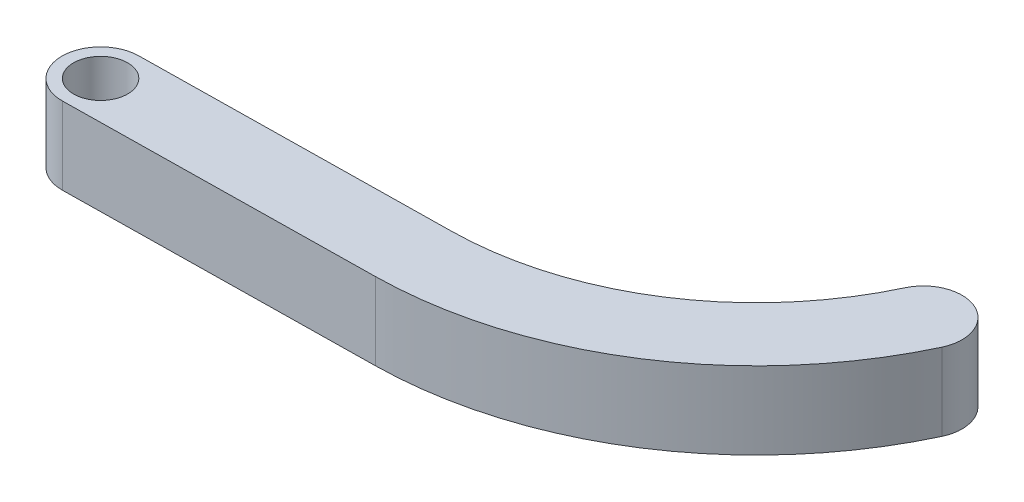
ISO-10303-21;
HEADER;
FILE_DESCRIPTION(('STEP AP214'),'2;1');
FILE_NAME('part.step','',(''),(''),'','','');
FILE_SCHEMA(('AUTOMOTIVE_DESIGN { 1 0 10303 214 1 1 1 1 }'));
ENDSEC;
DATA;
#1=APPLICATION_CONTEXT('core data for automotive mechanical design processes');
#2=APPLICATION_PROTOCOL_DEFINITION('international standard','automotive_design',2000,#1);
#3=PRODUCT_CONTEXT('',#1,'mechanical');
#4=PRODUCT('Part','Part','',(#3));
#5=PRODUCT_RELATED_PRODUCT_CATEGORY('part','',(#4));
#6=PRODUCT_DEFINITION_FORMATION('','',#4);
#7=PRODUCT_DEFINITION_CONTEXT('part definition',#1,'design');
#8=PRODUCT_DEFINITION('design','',#6,#7);
#9=PRODUCT_DEFINITION_SHAPE('','',#8);
#10=(LENGTH_UNIT() NAMED_UNIT(*) SI_UNIT(.MILLI.,.METRE.));
#11=(NAMED_UNIT(*) PLANE_ANGLE_UNIT() SI_UNIT($,.RADIAN.));
#12=(NAMED_UNIT(*) SI_UNIT($,.STERADIAN.) SOLID_ANGLE_UNIT());
#13=UNCERTAINTY_MEASURE_WITH_UNIT(LENGTH_MEASURE(1.E-05),#10,'distance_accuracy_value','');
#14=(GEOMETRIC_REPRESENTATION_CONTEXT(3) GLOBAL_UNCERTAINTY_ASSIGNED_CONTEXT((#13)) GLOBAL_UNIT_ASSIGNED_CONTEXT((#10,
#11,#12)) REPRESENTATION_CONTEXT('',''));
#15=CARTESIAN_POINT('',(0.,0.,0.));
#16=DIRECTION('',(0.,0.,1.));
#17=DIRECTION('',(1.,0.,0.));
#18=AXIS2_PLACEMENT_3D('',#15,#16,#17);
#19=CARTESIAN_POINT('',(24.9391059372929,6.35,-28.9400741014801));
#20=DIRECTION('',(0.,1.,0.));
#21=DIRECTION('',(0.,0.,1.));
#22=AXIS2_PLACEMENT_3D('',#19,#20,#21);
#23=PLANE('',#22);
#24=CARTESIAN_POINT('',(24.9391059372929,6.35,-28.9400741014801));
#25=DIRECTION('',(0.,-1.,0.));
#26=DIRECTION('',(0.,0.,1.));
#27=AXIS2_PLACEMENT_3D('',#24,#25,#26);
#28=CIRCLE('',#27,25.4);
#29=CARTESIAN_POINT('',(47.9265673263659,6.35,-18.1356019308518));
#30=VERTEX_POINT('',#29);
#31=CARTESIAN_POINT('',(25.3078211874586,6.35,-3.54275044200187));
#32=VERTEX_POINT('',#31);
#33=EDGE_CURVE('E164',#30,#32,#28,.T.);
#34=ORIENTED_EDGE('',*,*,#33,.T.);
#35=DIRECTION('',(-0.999894632262925,0.,0.0145163484317183));
#36=VECTOR('',#35,1.);
#37=CARTESIAN_POINT('',(-0.0460894062707055,6.35,-3.17466545743479));
#38=LINE('',#37,#36);
#39=CARTESIAN_POINT('',(-0.0460894062707055,6.35,-3.17466545743479));
#40=VERTEX_POINT('',#39);
#41=EDGE_CURVE('E110',#32,#40,#38,.T.);
#42=ORIENTED_EDGE('',*,*,#41,.T.);
#43=CARTESIAN_POINT('',(0.,6.35,0.));
#44=DIRECTION('',(0.,1.,0.));
#45=DIRECTION('',(0.,0.,1.));
#46=AXIS2_PLACEMENT_3D('',#43,#44,#45);
#47=CIRCLE('',#46,3.17500000000005);
#48=CARTESIAN_POINT('',(0.0460894062706943,6.35,3.17466545743483));
#49=VERTEX_POINT('',#48);
#50=EDGE_CURVE('E125',#40,#49,#47,.T.);
#51=ORIENTED_EDGE('',*,*,#50,.T.);
#52=DIRECTION('',(0.999894632262925,0.,-0.0145163484317183));
#53=VECTOR('',#52,1.);
#54=CARTESIAN_POINT('',(0.0460894062706942,6.35,3.17466545743488));
#55=LINE('',#54,#53);
#56=CARTESIAN_POINT('',(25.4,6.35,2.80658047286779));
#57=VERTEX_POINT('',#56);
#58=EDGE_CURVE('E119',#49,#57,#55,.T.);
#59=ORIENTED_EDGE('',*,*,#58,.T.);
#60=CARTESIAN_POINT('',(24.9391059372929,6.35,-28.9400741014801));
#61=DIRECTION('',(0.,1.,0.));
#62=DIRECTION('',(0.,0.,1.));
#63=AXIS2_PLACEMENT_3D('',#60,#61,#62);
#64=CIRCLE('',#63,31.75);
#65=CARTESIAN_POINT('',(53.6734326736341,6.35,-15.4344838881948));
#66=VERTEX_POINT('',#65);
#67=EDGE_CURVE('E123',#57,#66,#64,.T.);
#68=ORIENTED_EDGE('',*,*,#67,.T.);
#69=CARTESIAN_POINT('',(50.8,6.35,-16.7850429095233));
#70=DIRECTION('',(0.,1.,0.));
#71=DIRECTION('',(0.,0.,1.));
#72=AXIS2_PLACEMENT_3D('',#69,#70,#71);
#73=CIRCLE('',#72,3.175);
#74=EDGE_CURVE('E66',#66,#30,#73,.T.);
#75=ORIENTED_EDGE('',*,*,#74,.T.);
#76=EDGE_LOOP('',(#34,#42,#51,#59,#68,#75));
#77=FACE_BOUND('',#76,.T.);
#78=CARTESIAN_POINT('',(0.,6.35,0.));
#79=DIRECTION('',(0.,1.,0.));
#80=DIRECTION('',(0.,0.,1.));
#81=AXIS2_PLACEMENT_3D('',#78,#79,#80);
#82=CIRCLE('',#81,2.2225);
#83=CARTESIAN_POINT('',(0.,6.35,2.2225));
#84=VERTEX_POINT('',#83);
#85=EDGE_CURVE('E153',#84,#84,#82,.T.);
#86=ORIENTED_EDGE('',*,*,#85,.F.);
#87=EDGE_LOOP('',(#86));
#88=FACE_BOUND('',#87,.T.);
#89=ADVANCED_FACE('F45',(#77,#88),#23,.T.);
#90=CARTESIAN_POINT('',(24.9391059372929,0.,-28.9400741014801));
#91=DIRECTION('',(0.,1.,0.));
#92=DIRECTION('',(0.,0.,1.));
#93=AXIS2_PLACEMENT_3D('',#90,#91,#92);
#94=PLANE('',#93);
#95=CARTESIAN_POINT('',(24.9391059372929,0.,-28.9400741014801));
#96=DIRECTION('',(0.,-1.,0.));
#97=DIRECTION('',(0.,0.,1.));
#98=AXIS2_PLACEMENT_3D('',#95,#96,#97);
#99=CIRCLE('',#98,25.4);
#100=CARTESIAN_POINT('',(47.9265673263659,0.,-18.1356019308518));
#101=VERTEX_POINT('',#100);
#102=CARTESIAN_POINT('',(25.3078211874586,0.,-3.54275044200187));
#103=VERTEX_POINT('',#102);
#104=EDGE_CURVE('E148',#101,#103,#99,.T.);
#105=ORIENTED_EDGE('',*,*,#104,.F.);
#106=CARTESIAN_POINT('',(50.8,0.,-16.7850429095233));
#107=DIRECTION('',(0.,1.,0.));
#108=DIRECTION('',(0.,0.,1.));
#109=AXIS2_PLACEMENT_3D('',#106,#107,#108);
#110=CIRCLE('',#109,3.175);
#111=CARTESIAN_POINT('',(53.6734326736341,0.,-15.4344838881948));
#112=VERTEX_POINT('',#111);
#113=EDGE_CURVE('E100',#112,#101,#110,.T.);
#114=ORIENTED_EDGE('',*,*,#113,.F.);
#115=CARTESIAN_POINT('',(24.9391059372929,0.,-28.9400741014801));
#116=DIRECTION('',(0.,1.,0.));
#117=DIRECTION('',(0.,0.,1.));
#118=AXIS2_PLACEMENT_3D('',#115,#116,#117);
#119=CIRCLE('',#118,31.75);
#120=CARTESIAN_POINT('',(25.4,0.,2.80658047286779));
#121=VERTEX_POINT('',#120);
#122=EDGE_CURVE('E94',#121,#112,#119,.T.);
#123=ORIENTED_EDGE('',*,*,#122,.F.);
#124=DIRECTION('',(0.999894632262925,0.,-0.0145163484317183));
#125=VECTOR('',#124,1.);
#126=CARTESIAN_POINT('',(0.0460894062706942,0.,3.17466545743488));
#127=LINE('',#126,#125);
#128=CARTESIAN_POINT('',(0.0460894062706943,0.,3.17466545743483));
#129=VERTEX_POINT('',#128);
#130=EDGE_CURVE('E134',#129,#121,#127,.T.);
#131=ORIENTED_EDGE('',*,*,#130,.F.);
#132=CARTESIAN_POINT('',(0.,0.,0.));
#133=DIRECTION('',(0.,1.,0.));
#134=DIRECTION('',(0.,0.,1.));
#135=AXIS2_PLACEMENT_3D('',#132,#133,#134);
#136=CIRCLE('',#135,3.17500000000005);
#137=CARTESIAN_POINT('',(-0.0460894062707055,0.,-3.17466545743479));
#138=VERTEX_POINT('',#137);
#139=EDGE_CURVE('E156',#138,#129,#136,.T.);
#140=ORIENTED_EDGE('',*,*,#139,.F.);
#141=DIRECTION('',(-0.999894632262925,0.,0.0145163484317183));
#142=VECTOR('',#141,1.);
#143=CARTESIAN_POINT('',(-0.0460894062707055,0.,-3.17466545743479));
#144=LINE('',#143,#142);
#145=EDGE_CURVE('E152',#103,#138,#144,.T.);
#146=ORIENTED_EDGE('',*,*,#145,.F.);
#147=EDGE_LOOP('',(#105,#114,#123,#131,#140,#146));
#148=FACE_BOUND('',#147,.T.);
#149=CARTESIAN_POINT('',(0.,0.,0.));
#150=DIRECTION('',(0.,1.,0.));
#151=DIRECTION('',(0.,0.,1.));
#152=AXIS2_PLACEMENT_3D('',#149,#150,#151);
#153=CIRCLE('',#152,2.2225);
#154=CARTESIAN_POINT('',(0.,0.,2.2225));
#155=VERTEX_POINT('',#154);
#156=EDGE_CURVE('E271',#155,#155,#153,.T.);
#157=ORIENTED_EDGE('',*,*,#156,.T.);
#158=EDGE_LOOP('',(#157));
#159=FACE_BOUND('',#158,.T.);
#160=ADVANCED_FACE('F178',(#148,#159),#94,.F.);
#161=CARTESIAN_POINT('',(24.9391059372929,6.35,-28.9400741014801));
#162=DIRECTION('',(0.,-1.,0.));
#163=DIRECTION('',(0.,0.,-1.));
#164=AXIS2_PLACEMENT_3D('',#161,#162,#163);
#165=CYLINDRICAL_SURFACE('',#164,25.4);
#166=ORIENTED_EDGE('',*,*,#104,.T.);
#167=DIRECTION('',(0.,-1.,0.));
#168=VECTOR('',#167,1.);
#169=CARTESIAN_POINT('',(25.3078211874586,6.35,-3.54275044200187));
#170=LINE('',#169,#168);
#171=EDGE_CURVE('E11',#32,#103,#170,.T.);
#172=ORIENTED_EDGE('',*,*,#171,.F.);
#173=ORIENTED_EDGE('',*,*,#33,.F.);
#174=DIRECTION('',(0.,-1.,0.));
#175=VECTOR('',#174,1.);
#176=CARTESIAN_POINT('',(47.9265673263659,6.35,-18.1356019308518));
#177=LINE('',#176,#175);
#178=EDGE_CURVE('E144',#30,#101,#177,.T.);
#179=ORIENTED_EDGE('',*,*,#178,.T.);
#180=EDGE_LOOP('',(#166,#172,#173,#179));
#181=FACE_BOUND('',#180,.T.);
#182=ADVANCED_FACE('F47',(#181),#165,.F.);
#183=CARTESIAN_POINT('',(-0.0460894062707055,6.35,-3.17466545743479));
#184=DIRECTION('',(0.0145163484317183,0.,0.999894632262924));
#185=DIRECTION('',(0.999894632262925,0.,-0.0145163484317183));
#186=AXIS2_PLACEMENT_3D('',#183,#184,#185);
#187=PLANE('',#186);
#188=ORIENTED_EDGE('',*,*,#145,.T.);
#189=DIRECTION('',(0.,-1.,0.));
#190=VECTOR('',#189,1.);
#191=CARTESIAN_POINT('',(-0.0460894062707055,6.35,-3.17466545743479));
#192=LINE('',#191,#190);
#193=EDGE_CURVE('E55',#40,#138,#192,.T.);
#194=ORIENTED_EDGE('',*,*,#193,.F.);
#195=ORIENTED_EDGE('',*,*,#41,.F.);
#196=ORIENTED_EDGE('',*,*,#171,.T.);
#197=EDGE_LOOP('',(#188,#194,#195,#196));
#198=FACE_BOUND('',#197,.T.);
#199=ADVANCED_FACE('F202',(#198),#187,.F.);
#200=CARTESIAN_POINT('',(0.,6.35,0.));
#201=DIRECTION('',(0.,-1.,0.));
#202=DIRECTION('',(0.,0.,-1.));
#203=AXIS2_PLACEMENT_3D('',#200,#201,#202);
#204=CYLINDRICAL_SURFACE('',#203,3.17500000000005);
#205=ORIENTED_EDGE('',*,*,#139,.T.);
#206=DIRECTION('',(0.,-1.,0.));
#207=VECTOR('',#206,1.);
#208=CARTESIAN_POINT('',(0.0460894062706943,6.35,3.17466545743483));
#209=LINE('',#208,#207);
#210=EDGE_CURVE('E136',#49,#129,#209,.T.);
#211=ORIENTED_EDGE('',*,*,#210,.F.);
#212=ORIENTED_EDGE('',*,*,#50,.F.);
#213=ORIENTED_EDGE('',*,*,#193,.T.);
#214=EDGE_LOOP('',(#205,#211,#212,#213));
#215=FACE_BOUND('',#214,.T.);
#216=ADVANCED_FACE('F175',(#215),#204,.T.);
#217=CARTESIAN_POINT('',(0.0460894062706942,6.35,3.17466545743488));
#218=DIRECTION('',(-0.0145163484317183,0.,-0.999894632262924));
#219=DIRECTION('',(-0.999894632262925,0.,0.0145163484317183));
#220=AXIS2_PLACEMENT_3D('',#217,#218,#219);
#221=PLANE('',#220);
#222=ORIENTED_EDGE('',*,*,#130,.T.);
#223=DIRECTION('',(0.,-1.,0.));
#224=VECTOR('',#223,1.);
#225=CARTESIAN_POINT('',(25.4,6.35,2.80658047286779));
#226=LINE('',#225,#224);
#227=EDGE_CURVE('E131',#57,#121,#226,.T.);
#228=ORIENTED_EDGE('',*,*,#227,.F.);
#229=ORIENTED_EDGE('',*,*,#58,.F.);
#230=ORIENTED_EDGE('',*,*,#210,.T.);
#231=EDGE_LOOP('',(#222,#228,#229,#230));
#232=FACE_BOUND('',#231,.T.);
#233=ADVANCED_FACE('F132',(#232),#221,.F.);
#234=CARTESIAN_POINT('',(24.9391059372929,6.35,-28.9400741014801));
#235=DIRECTION('',(0.,-1.,0.));
#236=DIRECTION('',(0.,0.,-1.));
#237=AXIS2_PLACEMENT_3D('',#234,#235,#236);
#238=CYLINDRICAL_SURFACE('',#237,31.75);
#239=ORIENTED_EDGE('',*,*,#122,.T.);
#240=DIRECTION('',(0.,-1.,0.));
#241=VECTOR('',#240,1.);
#242=CARTESIAN_POINT('',(53.6734326736341,6.35,-15.4344838881948));
#243=LINE('',#242,#241);
#244=EDGE_CURVE('E137',#66,#112,#243,.T.);
#245=ORIENTED_EDGE('',*,*,#244,.F.);
#246=ORIENTED_EDGE('',*,*,#67,.F.);
#247=ORIENTED_EDGE('',*,*,#227,.T.);
#248=EDGE_LOOP('',(#239,#245,#246,#247));
#249=FACE_BOUND('',#248,.T.);
#250=ADVANCED_FACE('F139',(#249),#238,.T.);
#251=CARTESIAN_POINT('',(50.8,6.35,-16.7850429095233));
#252=DIRECTION('',(0.,-1.,0.));
#253=DIRECTION('',(0.,0.,-1.));
#254=AXIS2_PLACEMENT_3D('',#251,#252,#253);
#255=CYLINDRICAL_SURFACE('',#254,3.175);
#256=ORIENTED_EDGE('',*,*,#113,.T.);
#257=ORIENTED_EDGE('',*,*,#178,.F.);
#258=ORIENTED_EDGE('',*,*,#74,.F.);
#259=ORIENTED_EDGE('',*,*,#244,.T.);
#260=EDGE_LOOP('',(#256,#257,#258,#259));
#261=FACE_BOUND('',#260,.T.);
#262=ADVANCED_FACE('F183',(#261),#255,.T.);
#263=CARTESIAN_POINT('',(0.,6.35,0.));
#264=DIRECTION('',(0.,-1.,0.));
#265=DIRECTION('',(0.,0.,-1.));
#266=AXIS2_PLACEMENT_3D('',#263,#264,#265);
#267=CYLINDRICAL_SURFACE('',#266,2.2225);
#268=ORIENTED_EDGE('',*,*,#85,.T.);
#269=EDGE_LOOP('',(#268));
#270=FACE_BOUND('',#269,.T.);
#271=ORIENTED_EDGE('',*,*,#156,.F.);
#272=EDGE_LOOP('',(#271));
#273=FACE_BOUND('',#272,.T.);
#274=ADVANCED_FACE('F185',(#270,#273),#267,.F.);
#275=CLOSED_SHELL('',(#89,#160,#182,#199,#216,#233,#250,#262,#274));
#276=MANIFOLD_SOLID_BREP('B2',#275);
#277=ADVANCED_BREP_SHAPE_REPRESENTATION('',(#18,#276),#14);
#278=SHAPE_DEFINITION_REPRESENTATION(#9,#277);
ENDSEC;
END-ISO-10303-21;
